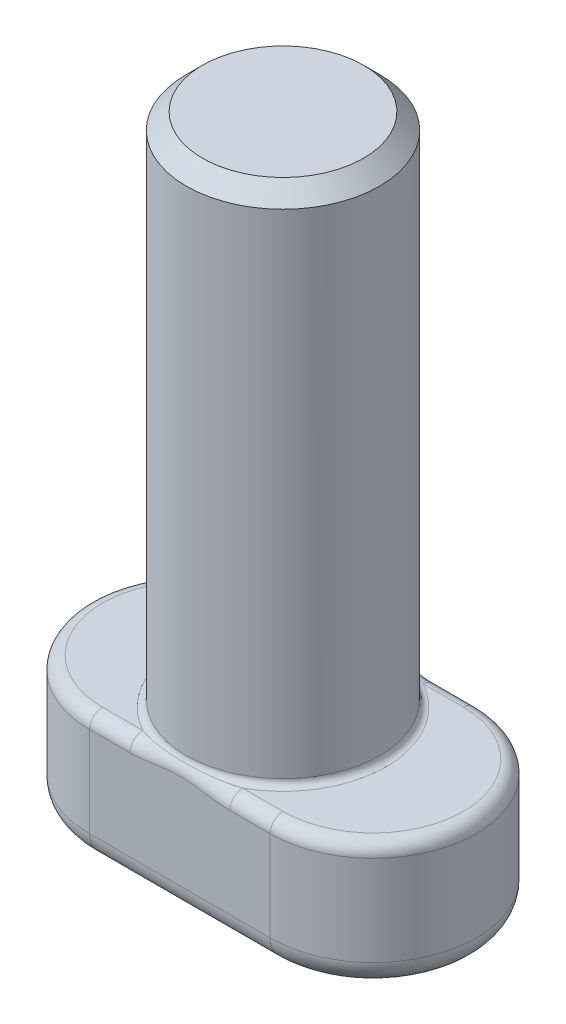
ISO-10303-21;
HEADER;
FILE_DESCRIPTION(('STEP AP214'),'2;1');
FILE_NAME('part.step','',(''),(''),'','','');
FILE_SCHEMA(('AUTOMOTIVE_DESIGN { 1 0 10303 214 1 1 1 1 }'));
ENDSEC;
DATA;
#1=APPLICATION_CONTEXT('core data for automotive mechanical design processes');
#2=APPLICATION_PROTOCOL_DEFINITION('international standard','automotive_design',2000,#1);
#3=PRODUCT_CONTEXT('',#1,'mechanical');
#4=PRODUCT('Part','Part','',(#3));
#5=PRODUCT_RELATED_PRODUCT_CATEGORY('part','',(#4));
#6=PRODUCT_DEFINITION_FORMATION('','',#4);
#7=PRODUCT_DEFINITION_CONTEXT('part definition',#1,'design');
#8=PRODUCT_DEFINITION('design','',#6,#7);
#9=PRODUCT_DEFINITION_SHAPE('','',#8);
#10=(LENGTH_UNIT() NAMED_UNIT(*) SI_UNIT(.MILLI.,.METRE.));
#11=(NAMED_UNIT(*) PLANE_ANGLE_UNIT() SI_UNIT($,.RADIAN.));
#12=(NAMED_UNIT(*) SI_UNIT($,.STERADIAN.) SOLID_ANGLE_UNIT());
#13=UNCERTAINTY_MEASURE_WITH_UNIT(LENGTH_MEASURE(1.E-05),#10,'distance_accuracy_value','');
#14=(GEOMETRIC_REPRESENTATION_CONTEXT(3) GLOBAL_UNCERTAINTY_ASSIGNED_CONTEXT((#13)) GLOBAL_UNIT_ASSIGNED_CONTEXT((#10,
#11,#12)) REPRESENTATION_CONTEXT('',''));
#15=CARTESIAN_POINT('',(0.,0.,0.));
#16=DIRECTION('',(0.,0.,1.));
#17=DIRECTION('',(1.,0.,0.));
#18=AXIS2_PLACEMENT_3D('',#15,#16,#17);
#19=CARTESIAN_POINT('',(1.4,0.,-1.6));
#20=DIRECTION('',(0.,0.,-1.));
#21=DIRECTION('',(-1.,0.,0.));
#22=AXIS2_PLACEMENT_3D('',#19,#20,#21);
#23=PLANE('',#22);
#24=DIRECTION('',(-1.,0.,0.));
#25=VECTOR('',#24,1.);
#26=CARTESIAN_POINT('',(1.4,1.8,-1.6));
#27=LINE('',#26,#25);
#28=CARTESIAN_POINT('',(0.774596669241484,1.8,-1.6));
#29=VERTEX_POINT('',#28);
#30=CARTESIAN_POINT('',(1.4,1.8,-1.6));
#31=VERTEX_POINT('',#30);
#32=EDGE_CURVE('E369',#29,#31,#27,.F.);
#33=ORIENTED_EDGE('',*,*,#32,.T.);
#34=DIRECTION('',(0.,1.,0.));
#35=VECTOR('',#34,1.);
#36=CARTESIAN_POINT('',(1.4,0.,-1.6));
#37=LINE('',#36,#35);
#38=CARTESIAN_POINT('',(1.4,0.4,-1.6));
#39=VERTEX_POINT('',#38);
#40=EDGE_CURVE('E374',#31,#39,#37,.F.);
#41=ORIENTED_EDGE('',*,*,#40,.T.);
#42=DIRECTION('',(-1.,0.,0.));
#43=VECTOR('',#42,1.);
#44=CARTESIAN_POINT('',(0.700000000000001,0.4,-1.6));
#45=LINE('',#44,#43);
#46=CARTESIAN_POINT('',(-1.40000000000001,0.4,-1.6));
#47=VERTEX_POINT('',#46);
#48=EDGE_CURVE('E144',#47,#39,#45,.F.);
#49=ORIENTED_EDGE('',*,*,#48,.F.);
#50=DIRECTION('',(0.,1.,0.));
#51=VECTOR('',#50,1.);
#52=CARTESIAN_POINT('',(-1.40000000000001,0.,-1.6));
#53=LINE('',#52,#51);
#54=CARTESIAN_POINT('',(-1.40000000000001,1.8,-1.6));
#55=VERTEX_POINT('',#54);
#56=EDGE_CURVE('E118',#47,#55,#53,.T.);
#57=ORIENTED_EDGE('',*,*,#56,.T.);
#58=DIRECTION('',(-1.,0.,0.));
#59=VECTOR('',#58,1.);
#60=CARTESIAN_POINT('',(1.4,1.8,-1.6));
#61=LINE('',#60,#59);
#62=CARTESIAN_POINT('',(-0.774596669241484,1.8,-1.6));
#63=VERTEX_POINT('',#62);
#64=EDGE_CURVE('E106',#55,#63,#61,.F.);
#65=ORIENTED_EDGE('',*,*,#64,.T.);
#66=CARTESIAN_POINT('',(0.774596669241484,1.8,-1.6));
#67=CARTESIAN_POINT('',(0.700387533813011,1.8,-1.6));
#68=CARTESIAN_POINT('',(0.552177147236711,1.81281167700233,-1.6));
#69=CARTESIAN_POINT('',(0.33258746979351,1.84782575622095,-1.6));
#70=CARTESIAN_POINT('',(0.111669796749093,1.87763804248562,-1.6));
#71=CARTESIAN_POINT('',(-0.11161902303895,1.87737160627196,-1.6));
#72=CARTESIAN_POINT('',(-0.332467757344064,1.84774445479143,-1.6));
#73=CARTESIAN_POINT('',(-0.552223442037981,1.81266375856778,-1.6));
#74=CARTESIAN_POINT('',(-0.700387533813012,1.8,-1.6));
#75=CARTESIAN_POINT('',(-0.774596669241484,1.8,-1.6));
#76=B_SPLINE_CURVE_WITH_KNOTS('',3,(#66,#67,#68,#69,#70,#71,#72,#73,#74,#75),.UNSPECIFIED.,.F.,
.F.,(4,1,1,1,1,1,1,4),(0.,0.0222627406285417,0.0445254812570834,0.0667882218856252,
0.0890509625141669,0.111313703142709,0.13357644377125,0.155839184399792),.UNSPECIFIED.);
#77=EDGE_CURVE('E117',#63,#29,#76,.F.);
#78=ORIENTED_EDGE('',*,*,#77,.T.);
#79=EDGE_LOOP('',(#33,#41,#49,#57,#65,#78));
#80=FACE_BOUND('',#79,.T.);
#81=ADVANCED_FACE('F16',(#80),#23,.T.);
#82=CARTESIAN_POINT('',(-1.4,0.,1.6));
#83=DIRECTION('',(0.,0.,1.));
#84=DIRECTION('',(1.,0.,0.));
#85=AXIS2_PLACEMENT_3D('',#82,#83,#84);
#86=PLANE('',#85);
#87=DIRECTION('',(1.,0.,0.));
#88=VECTOR('',#87,1.);
#89=CARTESIAN_POINT('',(-1.4,1.8,1.6));
#90=LINE('',#89,#88);
#91=CARTESIAN_POINT('',(-0.774596669241484,1.8,1.6));
#92=VERTEX_POINT('',#91);
#93=CARTESIAN_POINT('',(-1.4,1.8,1.6));
#94=VERTEX_POINT('',#93);
#95=EDGE_CURVE('E409',#92,#94,#90,.F.);
#96=ORIENTED_EDGE('',*,*,#95,.T.);
#97=DIRECTION('',(0.,1.,0.));
#98=VECTOR('',#97,1.);
#99=CARTESIAN_POINT('',(-1.4,0.,1.6));
#100=LINE('',#99,#98);
#101=CARTESIAN_POINT('',(-1.4,0.4,1.6));
#102=VERTEX_POINT('',#101);
#103=EDGE_CURVE('E137',#94,#102,#100,.F.);
#104=ORIENTED_EDGE('',*,*,#103,.T.);
#105=DIRECTION('',(1.,0.,0.));
#106=VECTOR('',#105,1.);
#107=CARTESIAN_POINT('',(-0.699999999999999,0.4,1.6));
#108=LINE('',#107,#106);
#109=CARTESIAN_POINT('',(1.4,0.4,1.6));
#110=VERTEX_POINT('',#109);
#111=EDGE_CURVE('E668',#110,#102,#108,.F.);
#112=ORIENTED_EDGE('',*,*,#111,.F.);
#113=DIRECTION('',(0.,1.,0.));
#114=VECTOR('',#113,1.);
#115=CARTESIAN_POINT('',(1.4,0.,1.6));
#116=LINE('',#115,#114);
#117=CARTESIAN_POINT('',(1.4,1.8,1.6));
#118=VERTEX_POINT('',#117);
#119=EDGE_CURVE('E378',#110,#118,#116,.T.);
#120=ORIENTED_EDGE('',*,*,#119,.T.);
#121=DIRECTION('',(1.,0.,0.));
#122=VECTOR('',#121,1.);
#123=CARTESIAN_POINT('',(-1.4,1.8,1.6));
#124=LINE('',#123,#122);
#125=CARTESIAN_POINT('',(0.774596669241484,1.8,1.6));
#126=VERTEX_POINT('',#125);
#127=EDGE_CURVE('E405',#118,#126,#124,.F.);
#128=ORIENTED_EDGE('',*,*,#127,.T.);
#129=CARTESIAN_POINT('',(-0.774596669241484,1.8,1.6));
#130=CARTESIAN_POINT('',(-0.700387533813012,1.8,1.6));
#131=CARTESIAN_POINT('',(-0.552177147236712,1.81281167700233,1.6));
#132=CARTESIAN_POINT('',(-0.332587469793511,1.84782575622095,1.6));
#133=CARTESIAN_POINT('',(-0.111669796749093,1.87763804248562,1.6));
#134=CARTESIAN_POINT('',(0.111619023038949,1.87737160627196,1.6));
#135=CARTESIAN_POINT('',(0.332467757344063,1.84774445479143,1.6));
#136=CARTESIAN_POINT('',(0.55222344203798,1.81266375856778,1.6));
#137=CARTESIAN_POINT('',(0.700387533813011,1.8,1.6));
#138=CARTESIAN_POINT('',(0.774596669241484,1.8,1.6));
#139=B_SPLINE_CURVE_WITH_KNOTS('',3,(#129,#130,#131,#132,#133,#134,#135,#136,#137,#138),
.UNSPECIFIED.,.F.,.F.,(4,1,1,1,1,1,1,4),(0.,0.0222627406285417,0.0445254812570835,
0.0667882218856252,0.0890509625141669,0.111313703142709,0.13357644377125,0.155839184399792),.UNSPECIFIED.);
#140=EDGE_CURVE('E158',#126,#92,#139,.F.);
#141=ORIENTED_EDGE('',*,*,#140,.T.);
#142=EDGE_LOOP('',(#96,#104,#112,#120,#128,#141));
#143=FACE_BOUND('',#142,.T.);
#144=ADVANCED_FACE('F421',(#143),#86,.T.);
#145=CARTESIAN_POINT('',(0.700000000000001,0.4,-1.2));
#146=DIRECTION('',(-1.,0.,0.));
#147=DIRECTION('',(0.,0.,1.));
#148=AXIS2_PLACEMENT_3D('',#145,#146,#147);
#149=CYLINDRICAL_SURFACE('',#148,0.4);
#150=CARTESIAN_POINT('',(1.4,0.4,-1.2));
#151=DIRECTION('',(-1.,0.,0.));
#152=DIRECTION('',(0.,0.,1.));
#153=AXIS2_PLACEMENT_3D('',#150,#151,#152);
#154=CIRCLE('',#153,0.4);
#155=CARTESIAN_POINT('',(1.4,0.,-1.2));
#156=VERTEX_POINT('',#155);
#157=EDGE_CURVE('E395',#39,#156,#154,.T.);
#158=ORIENTED_EDGE('',*,*,#157,.T.);
#159=DIRECTION('',(1.,0.,0.));
#160=VECTOR('',#159,1.);
#161=CARTESIAN_POINT('',(0.,0.,-1.2));
#162=LINE('',#161,#160);
#163=CARTESIAN_POINT('',(-1.40000000000001,0.,-1.2));
#164=VERTEX_POINT('',#163);
#165=EDGE_CURVE('E473',#156,#164,#162,.F.);
#166=ORIENTED_EDGE('',*,*,#165,.T.);
#167=CARTESIAN_POINT('',(-1.40000000000001,0.4,-1.2));
#168=DIRECTION('',(-1.,0.,0.));
#169=DIRECTION('',(0.,0.,1.));
#170=AXIS2_PLACEMENT_3D('',#167,#168,#169);
#171=CIRCLE('',#170,0.4);
#172=EDGE_CURVE('E396',#164,#47,#171,.F.);
#173=ORIENTED_EDGE('',*,*,#172,.T.);
#174=ORIENTED_EDGE('',*,*,#48,.T.);
#175=EDGE_LOOP('',(#158,#166,#173,#174));
#176=FACE_BOUND('',#175,.T.);
#177=ADVANCED_FACE('F430',(#176),#149,.T.);
#178=CARTESIAN_POINT('',(-0.699999999999999,0.4,1.2));
#179=DIRECTION('',(1.,0.,0.));
#180=DIRECTION('',(0.,0.,-1.));
#181=AXIS2_PLACEMENT_3D('',#178,#179,#180);
#182=CYLINDRICAL_SURFACE('',#181,0.4);
#183=CARTESIAN_POINT('',(-1.4,0.4,1.2));
#184=DIRECTION('',(1.,0.,0.));
#185=DIRECTION('',(0.,0.,-1.));
#186=AXIS2_PLACEMENT_3D('',#183,#184,#185);
#187=CIRCLE('',#186,0.4);
#188=CARTESIAN_POINT('',(-1.4,0.,1.2));
#189=VERTEX_POINT('',#188);
#190=EDGE_CURVE('E482',#102,#189,#187,.T.);
#191=ORIENTED_EDGE('',*,*,#190,.T.);
#192=DIRECTION('',(1.,0.,0.));
#193=VECTOR('',#192,1.);
#194=CARTESIAN_POINT('',(0.,0.,1.2));
#195=LINE('',#194,#193);
#196=CARTESIAN_POINT('',(1.4,0.,1.2));
#197=VERTEX_POINT('',#196);
#198=EDGE_CURVE('E470',#189,#197,#195,.T.);
#199=ORIENTED_EDGE('',*,*,#198,.T.);
#200=CARTESIAN_POINT('',(1.4,0.4,1.2));
#201=DIRECTION('',(1.,0.,0.));
#202=DIRECTION('',(0.,0.,-1.));
#203=AXIS2_PLACEMENT_3D('',#200,#201,#202);
#204=CIRCLE('',#203,0.4);
#205=EDGE_CURVE('E666',#197,#110,#204,.F.);
#206=ORIENTED_EDGE('',*,*,#205,.T.);
#207=ORIENTED_EDGE('',*,*,#111,.T.);
#208=EDGE_LOOP('',(#191,#199,#206,#207));
#209=FACE_BOUND('',#208,.T.);
#210=ADVANCED_FACE('F434',(#209),#182,.T.);
#211=CARTESIAN_POINT('',(0.,0.,0.));
#212=DIRECTION('',(0.,1.,0.));
#213=DIRECTION('',(0.,0.,1.));
#214=AXIS2_PLACEMENT_3D('',#211,#212,#213);
#215=PLANE('',#214);
#216=ORIENTED_EDGE('',*,*,#198,.F.);
#217=CARTESIAN_POINT('',(-1.4,0.,0.));
#218=DIRECTION('',(0.,1.,0.));
#219=DIRECTION('',(0.,0.,-1.));
#220=AXIS2_PLACEMENT_3D('',#217,#218,#219);
#221=CIRCLE('',#220,1.2);
#222=EDGE_CURVE('E476',#164,#189,#221,.T.);
#223=ORIENTED_EDGE('',*,*,#222,.F.);
#224=ORIENTED_EDGE('',*,*,#165,.F.);
#225=CARTESIAN_POINT('',(1.4,0.,0.));
#226=DIRECTION('',(0.,1.,0.));
#227=DIRECTION('',(0.,0.,1.));
#228=AXIS2_PLACEMENT_3D('',#225,#226,#227);
#229=CIRCLE('',#228,1.2);
#230=EDGE_CURVE('E468',#197,#156,#229,.T.);
#231=ORIENTED_EDGE('',*,*,#230,.F.);
#232=EDGE_LOOP('',(#216,#223,#224,#231));
#233=FACE_BOUND('',#232,.T.);
#234=ADVANCED_FACE('F438',(#233),#215,.F.);
#235=CARTESIAN_POINT('',(-1.4,0.4,0.));
#236=DIRECTION('',(0.,1.,0.));
#237=DIRECTION('',(0.,0.,1.));
#238=AXIS2_PLACEMENT_3D('',#235,#236,#237);
#239=TOROIDAL_SURFACE('',#238,1.2,0.4);
#240=ORIENTED_EDGE('',*,*,#172,.F.);
#241=ORIENTED_EDGE('',*,*,#222,.T.);
#242=ORIENTED_EDGE('',*,*,#190,.F.);
#243=CARTESIAN_POINT('',(-1.4,0.4,0.));
#244=DIRECTION('',(0.,1.,0.));
#245=DIRECTION('',(0.,0.,1.));
#246=AXIS2_PLACEMENT_3D('',#243,#244,#245);
#247=CIRCLE('',#246,1.6);
#248=EDGE_CURVE('E401',#47,#102,#247,.T.);
#249=ORIENTED_EDGE('',*,*,#248,.F.);
#250=EDGE_LOOP('',(#240,#241,#242,#249));
#251=FACE_BOUND('',#250,.T.);
#252=ADVANCED_FACE('F443',(#251),#239,.T.);
#253=CARTESIAN_POINT('',(1.4,0.4,0.));
#254=DIRECTION('',(0.,1.,0.));
#255=DIRECTION('',(0.,0.,1.));
#256=AXIS2_PLACEMENT_3D('',#253,#254,#255);
#257=TOROIDAL_SURFACE('',#256,1.2,0.4);
#258=ORIENTED_EDGE('',*,*,#157,.F.);
#259=CARTESIAN_POINT('',(1.4,0.4,0.));
#260=DIRECTION('',(0.,1.,0.));
#261=DIRECTION('',(0.,0.,1.));
#262=AXIS2_PLACEMENT_3D('',#259,#260,#261);
#263=CIRCLE('',#262,1.6);
#264=EDGE_CURVE('E139',#110,#39,#263,.T.);
#265=ORIENTED_EDGE('',*,*,#264,.F.);
#266=ORIENTED_EDGE('',*,*,#205,.F.);
#267=ORIENTED_EDGE('',*,*,#230,.T.);
#268=EDGE_LOOP('',(#258,#265,#266,#267));
#269=FACE_BOUND('',#268,.T.);
#270=ADVANCED_FACE('F492',(#269),#257,.T.);
#271=CARTESIAN_POINT('',(-1.4,0.,0.));
#272=DIRECTION('',(0.,1.,0.));
#273=DIRECTION('',(0.,0.,1.));
#274=AXIS2_PLACEMENT_3D('',#271,#272,#273);
#275=CYLINDRICAL_SURFACE('',#274,1.6);
#276=CARTESIAN_POINT('',(-1.4,1.8,0.));
#277=DIRECTION('',(0.,1.,0.));
#278=DIRECTION('',(0.,0.,1.));
#279=AXIS2_PLACEMENT_3D('',#276,#277,#278);
#280=CIRCLE('',#279,1.6);
#281=EDGE_CURVE('E124',#55,#94,#280,.T.);
#282=ORIENTED_EDGE('',*,*,#281,.F.);
#283=ORIENTED_EDGE('',*,*,#56,.F.);
#284=ORIENTED_EDGE('',*,*,#248,.T.);
#285=ORIENTED_EDGE('',*,*,#103,.F.);
#286=EDGE_LOOP('',(#282,#283,#284,#285));
#287=FACE_BOUND('',#286,.T.);
#288=ADVANCED_FACE('F134',(#287),#275,.T.);
#289=CARTESIAN_POINT('',(1.4,0.,0.));
#290=DIRECTION('',(0.,1.,0.));
#291=DIRECTION('',(0.,0.,1.));
#292=AXIS2_PLACEMENT_3D('',#289,#290,#291);
#293=CYLINDRICAL_SURFACE('',#292,1.6);
#294=CARTESIAN_POINT('',(1.4,1.8,0.));
#295=DIRECTION('',(0.,1.,0.));
#296=DIRECTION('',(0.,0.,1.));
#297=AXIS2_PLACEMENT_3D('',#294,#295,#296);
#298=CIRCLE('',#297,1.6);
#299=EDGE_CURVE('E130',#118,#31,#298,.T.);
#300=ORIENTED_EDGE('',*,*,#299,.F.);
#301=ORIENTED_EDGE('',*,*,#119,.F.);
#302=ORIENTED_EDGE('',*,*,#264,.T.);
#303=ORIENTED_EDGE('',*,*,#40,.F.);
#304=EDGE_LOOP('',(#300,#301,#302,#303));
#305=FACE_BOUND('',#304,.T.);
#306=ADVANCED_FACE('F524',(#305),#293,.T.);
#307=CARTESIAN_POINT('',(-1.4,1.8,0.));
#308=DIRECTION('',(0.,1.,0.));
#309=DIRECTION('',(0.,0.,1.));
#310=AXIS2_PLACEMENT_3D('',#307,#308,#309);
#311=TOROIDAL_SURFACE('',#310,1.4,0.2);
#312=CARTESIAN_POINT('',(-1.40000000000001,1.8,-1.4));
#313=DIRECTION('',(-1.,0.,0.));
#314=DIRECTION('',(0.,0.,1.));
#315=AXIS2_PLACEMENT_3D('',#312,#313,#314);
#316=CIRCLE('',#315,0.2);
#317=CARTESIAN_POINT('',(-1.40000000000001,2.,-1.4));
#318=VERTEX_POINT('',#317);
#319=EDGE_CURVE('E109',#55,#318,#316,.F.);
#320=ORIENTED_EDGE('',*,*,#319,.F.);
#321=ORIENTED_EDGE('',*,*,#281,.T.);
#322=CARTESIAN_POINT('',(-1.4,1.8,1.4));
#323=DIRECTION('',(1.,0.,0.));
#324=DIRECTION('',(0.,0.,-1.));
#325=AXIS2_PLACEMENT_3D('',#322,#323,#324);
#326=CIRCLE('',#325,0.2);
#327=CARTESIAN_POINT('',(-1.4,2.,1.4));
#328=VERTEX_POINT('',#327);
#329=EDGE_CURVE('E266',#328,#94,#326,.T.);
#330=ORIENTED_EDGE('',*,*,#329,.F.);
#331=CARTESIAN_POINT('',(-1.4,2.,0.));
#332=DIRECTION('',(0.,-1.,0.));
#333=DIRECTION('',(0.,0.,1.));
#334=AXIS2_PLACEMENT_3D('',#331,#332,#333);
#335=CIRCLE('',#334,1.4);
#336=EDGE_CURVE('E127',#318,#328,#335,.F.);
#337=ORIENTED_EDGE('',*,*,#336,.F.);
#338=EDGE_LOOP('',(#320,#321,#330,#337));
#339=FACE_BOUND('',#338,.T.);
#340=ADVANCED_FACE('F123',(#339),#311,.T.);
#341=CARTESIAN_POINT('',(0.700000000000001,1.8,-1.4));
#342=DIRECTION('',(-1.,0.,0.));
#343=DIRECTION('',(0.,0.,1.));
#344=AXIS2_PLACEMENT_3D('',#341,#342,#343);
#345=CYLINDRICAL_SURFACE('',#344,0.2);
#346=ORIENTED_EDGE('',*,*,#319,.T.);
#347=DIRECTION('',(1.,0.,0.));
#348=VECTOR('',#347,1.);
#349=CARTESIAN_POINT('',(0.,2.,-1.4));
#350=LINE('',#349,#348);
#351=CARTESIAN_POINT('',(-0.774596669241484,2.,-1.4));
#352=VERTEX_POINT('',#351);
#353=EDGE_CURVE('E695',#352,#318,#350,.F.);
#354=ORIENTED_EDGE('',*,*,#353,.F.);
#355=CARTESIAN_POINT('',(-0.774596669241484,1.8,-1.6));
#356=CARTESIAN_POINT('',(-0.774596669241484,1.85235987755983,-1.6));
#357=CARTESIAN_POINT('',(-0.774596669241484,1.95672309645721,-1.55672309645721));
#358=CARTESIAN_POINT('',(-0.774596669241484,2.,-1.45235987755983));
#359=CARTESIAN_POINT('',(-0.774596669241484,2.,-1.4));
#360=B_SPLINE_CURVE_WITH_KNOTS('',3,(#355,#356,#357,#358,#359),.UNSPECIFIED.,.F.,.F.,(4,1,4),
(0.,0.5,1.),.UNSPECIFIED.);
#361=EDGE_CURVE('E112',#352,#63,#360,.F.);
#362=ORIENTED_EDGE('',*,*,#361,.T.);
#363=ORIENTED_EDGE('',*,*,#64,.F.);
#364=EDGE_LOOP('',(#346,#354,#362,#363));
#365=FACE_BOUND('',#364,.T.);
#366=ADVANCED_FACE('F108',(#365),#345,.T.);
#367=CARTESIAN_POINT('',(1.4,1.8,0.));
#368=DIRECTION('',(0.,1.,0.));
#369=DIRECTION('',(0.,0.,1.));
#370=AXIS2_PLACEMENT_3D('',#367,#368,#369);
#371=TOROIDAL_SURFACE('',#370,1.4,0.2);
#372=CARTESIAN_POINT('',(1.4,1.8,1.4));
#373=DIRECTION('',(1.,0.,0.));
#374=DIRECTION('',(0.,0.,-1.));
#375=AXIS2_PLACEMENT_3D('',#372,#373,#374);
#376=CIRCLE('',#375,0.2);
#377=CARTESIAN_POINT('',(1.4,2.,1.4));
#378=VERTEX_POINT('',#377);
#379=EDGE_CURVE('E258',#118,#378,#376,.F.);
#380=ORIENTED_EDGE('',*,*,#379,.F.);
#381=ORIENTED_EDGE('',*,*,#299,.T.);
#382=CARTESIAN_POINT('',(1.4,1.8,-1.4));
#383=DIRECTION('',(-1.,0.,0.));
#384=DIRECTION('',(0.,0.,1.));
#385=AXIS2_PLACEMENT_3D('',#382,#383,#384);
#386=CIRCLE('',#385,0.2);
#387=CARTESIAN_POINT('',(1.4,2.,-1.4));
#388=VERTEX_POINT('',#387);
#389=EDGE_CURVE('E367',#388,#31,#386,.T.);
#390=ORIENTED_EDGE('',*,*,#389,.F.);
#391=CARTESIAN_POINT('',(1.4,2.,0.));
#392=DIRECTION('',(0.,-1.,0.));
#393=DIRECTION('',(0.,0.,-1.));
#394=AXIS2_PLACEMENT_3D('',#391,#392,#393);
#395=CIRCLE('',#394,1.4);
#396=EDGE_CURVE('E254',#378,#388,#395,.F.);
#397=ORIENTED_EDGE('',*,*,#396,.F.);
#398=EDGE_LOOP('',(#380,#381,#390,#397));
#399=FACE_BOUND('',#398,.T.);
#400=ADVANCED_FACE('F235',(#399),#371,.T.);
#401=CARTESIAN_POINT('',(0.700000000000001,1.8,-1.4));
#402=DIRECTION('',(-1.,0.,0.));
#403=DIRECTION('',(0.,0.,1.));
#404=AXIS2_PLACEMENT_3D('',#401,#402,#403);
#405=CYLINDRICAL_SURFACE('',#404,0.2);
#406=ORIENTED_EDGE('',*,*,#389,.T.);
#407=ORIENTED_EDGE('',*,*,#32,.F.);
#408=CARTESIAN_POINT('',(0.774596669241484,2.,-1.4));
#409=CARTESIAN_POINT('',(0.774596669241484,2.,-1.45235987755983));
#410=CARTESIAN_POINT('',(0.774596669241484,1.95672309645721,-1.55672309645721));
#411=CARTESIAN_POINT('',(0.774596669241484,1.85235987755983,-1.6));
#412=CARTESIAN_POINT('',(0.774596669241484,1.8,-1.6));
#413=B_SPLINE_CURVE_WITH_KNOTS('',3,(#408,#409,#410,#411,#412),.UNSPECIFIED.,.F.,.F.,(4,1,4),
(0.,0.5,1.),.UNSPECIFIED.);
#414=CARTESIAN_POINT('',(0.774596669241484,2.,-1.4));
#415=VERTEX_POINT('',#414);
#416=EDGE_CURVE('E217',#29,#415,#413,.F.);
#417=ORIENTED_EDGE('',*,*,#416,.T.);
#418=DIRECTION('',(1.,0.,0.));
#419=VECTOR('',#418,1.);
#420=CARTESIAN_POINT('',(0.,2.,-1.4));
#421=LINE('',#420,#419);
#422=EDGE_CURVE('E326',#388,#415,#421,.F.);
#423=ORIENTED_EDGE('',*,*,#422,.F.);
#424=EDGE_LOOP('',(#406,#407,#417,#423));
#425=FACE_BOUND('',#424,.T.);
#426=ADVANCED_FACE('F224',(#425),#405,.T.);
#427=CARTESIAN_POINT('',(-0.699999999999999,1.8,1.4));
#428=DIRECTION('',(1.,0.,0.));
#429=DIRECTION('',(0.,0.,-1.));
#430=AXIS2_PLACEMENT_3D('',#427,#428,#429);
#431=CYLINDRICAL_SURFACE('',#430,0.2);
#432=ORIENTED_EDGE('',*,*,#329,.T.);
#433=ORIENTED_EDGE('',*,*,#95,.F.);
#434=CARTESIAN_POINT('',(-0.774596669241484,2.,1.4));
#435=CARTESIAN_POINT('',(-0.774596669241484,2.,1.45235987755983));
#436=CARTESIAN_POINT('',(-0.774596669241484,1.95672309645721,1.55672309645721));
#437=CARTESIAN_POINT('',(-0.774596669241484,1.85235987755983,1.6));
#438=CARTESIAN_POINT('',(-0.774596669241484,1.8,1.6));
#439=B_SPLINE_CURVE_WITH_KNOTS('',3,(#434,#435,#436,#437,#438),.UNSPECIFIED.,.F.,.F.,(4,1,4),
(0.,0.5,1.),.UNSPECIFIED.);
#440=CARTESIAN_POINT('',(-0.774596669241484,2.,1.4));
#441=VERTEX_POINT('',#440);
#442=EDGE_CURVE('E328',#92,#441,#439,.F.);
#443=ORIENTED_EDGE('',*,*,#442,.T.);
#444=DIRECTION('',(1.,0.,0.));
#445=VECTOR('',#444,1.);
#446=CARTESIAN_POINT('',(0.,2.,1.4));
#447=LINE('',#446,#445);
#448=EDGE_CURVE('E265',#328,#441,#447,.T.);
#449=ORIENTED_EDGE('',*,*,#448,.F.);
#450=EDGE_LOOP('',(#432,#433,#443,#449));
#451=FACE_BOUND('',#450,.T.);
#452=ADVANCED_FACE('F234',(#451),#431,.T.);
#453=CARTESIAN_POINT('',(-0.699999999999999,1.8,1.4));
#454=DIRECTION('',(1.,0.,0.));
#455=DIRECTION('',(0.,0.,-1.));
#456=AXIS2_PLACEMENT_3D('',#453,#454,#455);
#457=CYLINDRICAL_SURFACE('',#456,0.2);
#458=ORIENTED_EDGE('',*,*,#379,.T.);
#459=DIRECTION('',(1.,0.,0.));
#460=VECTOR('',#459,1.);
#461=CARTESIAN_POINT('',(0.,2.,1.4));
#462=LINE('',#461,#460);
#463=CARTESIAN_POINT('',(0.774596669241484,2.,1.4));
#464=VERTEX_POINT('',#463);
#465=EDGE_CURVE('E38',#464,#378,#462,.T.);
#466=ORIENTED_EDGE('',*,*,#465,.F.);
#467=CARTESIAN_POINT('',(0.774596669241484,1.8,1.6));
#468=CARTESIAN_POINT('',(0.774596669241484,1.85235987755983,1.6));
#469=CARTESIAN_POINT('',(0.774596669241484,1.95672309645721,1.55672309645721));
#470=CARTESIAN_POINT('',(0.774596669241484,2.,1.45235987755983));
#471=CARTESIAN_POINT('',(0.774596669241484,2.,1.4));
#472=B_SPLINE_CURVE_WITH_KNOTS('',3,(#467,#468,#469,#470,#471),.UNSPECIFIED.,.F.,.F.,(4,1,4),
(0.,0.5,1.),.UNSPECIFIED.);
#473=EDGE_CURVE('E363',#464,#126,#472,.F.);
#474=ORIENTED_EDGE('',*,*,#473,.T.);
#475=ORIENTED_EDGE('',*,*,#127,.F.);
#476=EDGE_LOOP('',(#458,#466,#474,#475));
#477=FACE_BOUND('',#476,.T.);
#478=ADVANCED_FACE('F572',(#477),#457,.T.);
#479=CARTESIAN_POINT('',(0.,2.,0.));
#480=DIRECTION('',(0.,1.,0.));
#481=DIRECTION('',(0.,0.,1.));
#482=AXIS2_PLACEMENT_3D('',#479,#480,#481);
#483=PLANE('',#482);
#484=ORIENTED_EDGE('',*,*,#353,.T.);
#485=ORIENTED_EDGE('',*,*,#336,.T.);
#486=ORIENTED_EDGE('',*,*,#448,.T.);
#487=CARTESIAN_POINT('',(0.,2.,0.));
#488=DIRECTION('',(0.,1.,0.));
#489=DIRECTION('',(-0.484122918275928,0.,-0.875));
#490=AXIS2_PLACEMENT_3D('',#487,#488,#489);
#491=CIRCLE('',#490,1.6);
#492=EDGE_CURVE('E278',#441,#352,#491,.F.);
#493=ORIENTED_EDGE('',*,*,#492,.T.);
#494=EDGE_LOOP('',(#484,#485,#486,#493));
#495=FACE_BOUND('',#494,.T.);
#496=ADVANCED_FACE('F183',(#495),#483,.T.);
#497=CARTESIAN_POINT('',(0.774596669241484,1.8,-1.6));
#498=CARTESIAN_POINT('',(0.700387533813011,1.8,-1.6));
#499=CARTESIAN_POINT('',(0.552177147236711,1.81281167700233,-1.6));
#500=CARTESIAN_POINT('',(0.33258746979351,1.84782575622095,-1.6));
#501=CARTESIAN_POINT('',(0.111669796749093,1.87763804248562,-1.6));
#502=CARTESIAN_POINT('',(-0.11161902303895,1.87737160627196,-1.6));
#503=CARTESIAN_POINT('',(-0.332467757344064,1.84774445479143,-1.6));
#504=CARTESIAN_POINT('',(-0.552223442037981,1.81266375856778,-1.6));
#505=CARTESIAN_POINT('',(-0.700387533813012,1.8,-1.6));
#506=CARTESIAN_POINT('',(-0.774596669241484,1.8,-1.6));
#507=CARTESIAN_POINT('',(0.774596669241484,1.85235987755983,-1.6));
#508=CARTESIAN_POINT('',(0.703428100857881,1.8488359908818,-1.59988595040864));
#509=CARTESIAN_POINT('',(0.558168074914489,1.85451541078744,-1.59979902295523));
#510=CARTESIAN_POINT('',(0.337989942871566,1.8808831729616,-1.59971350327062));
#511=CARTESIAN_POINT('',(0.113781174115758,1.90539301559849,-1.59969449828969));
#512=CARTESIAN_POINT('',(-0.113730022935181,1.90515229930441,-1.59970133440548));
#513=CARTESIAN_POINT('',(-0.337870195056682,1.88080626148408,-1.59971122630322));
#514=CARTESIAN_POINT('',(-0.558215011005705,1.8543827100453,-1.59979881262343));
#515=CARTESIAN_POINT('',(-0.703428100857879,1.8488359908818,-1.59988595040864));
#516=CARTESIAN_POINT('',(-0.774596669241484,1.85235987755983,-1.6));
#517=CARTESIAN_POINT('',(0.774596669241484,1.95672309645721,-1.55672309645721));
#518=CARTESIAN_POINT('',(0.709458276680838,1.94645661466236,-1.56285100482593));
#519=CARTESIAN_POINT('',(0.570113761156739,1.93812687399193,-1.57308239618957));
#520=CARTESIAN_POINT('',(0.348783769278581,1.94735266095545,-1.58323689953137));
#521=CARTESIAN_POINT('',(0.118002503121437,1.96128412202342,-1.58844423997559));
#522=CARTESIAN_POINT('',(-0.117950546707858,1.9610861278276,-1.58843371743589));
#523=CARTESIAN_POINT('',(-0.348663800922481,1.94728759616185,-1.58324133056248));
#524=CARTESIAN_POINT('',(-0.570161930342631,1.93802491891547,-1.57307683311644));
#525=CARTESIAN_POINT('',(-0.709458276680831,1.94645661466236,-1.56285100482593));
#526=CARTESIAN_POINT('',(-0.774596669241484,1.95672309645721,-1.55672309645721));
#527=CARTESIAN_POINT('',(0.774596669241484,2.,-1.45235987755983));
#528=CARTESIAN_POINT('',(0.71200693089924,1.99439045316234,-1.46983679887216));
#529=CARTESIAN_POINT('',(0.577423251579639,1.99042372267585,-1.50152403852196));
#530=CARTESIAN_POINT('',(0.357128863946784,1.9973567133064,-1.53610004305196));
#531=CARTESIAN_POINT('',(0.121617702385998,2.00686770843667,-1.55496536904477));
#532=CARTESIAN_POINT('',(-0.121561728657003,2.00674786991036,-1.55492947834284));
#533=CARTESIAN_POINT('',(-0.357008891008973,1.99731082324637,-1.53610631585212));
#534=CARTESIAN_POINT('',(-0.57747332741644,1.99035572797392,-1.50149907681011));
#535=CARTESIAN_POINT('',(-0.712006930899231,1.99439045316234,-1.46983679887216));
#536=CARTESIAN_POINT('',(-0.774596669241484,2.,-1.45235987755983));
#537=CARTESIAN_POINT('',(0.774596669241484,2.,-1.4));
#538=CARTESIAN_POINT('',(0.71198271122372,2.,-1.42095703353705));
#539=CARTESIAN_POINT('',(0.579122806456343,2.00427055900078,-1.46106872397485));
#540=CARTESIAN_POINT('',(0.3601957038681,2.01594191874032,-1.50786989355545));
#541=CARTESIAN_POINT('',(0.123142575837898,2.02587934749521,-1.53444591069328));
#542=CARTESIAN_POINT('',(-0.1230829956571,2.02579053542399,-1.53438026430683));
#543=CARTESIAN_POINT('',(-0.360075091605916,2.01591481826381,-1.50787456417969));
#544=CARTESIAN_POINT('',(-0.579174578905693,2.00422125285593,-1.46102904808302));
#545=CARTESIAN_POINT('',(-0.71198271122371,2.,-1.42095703353705));
#546=CARTESIAN_POINT('',(-0.774596669241484,2.,-1.4));
#547=B_SPLINE_SURFACE_WITH_KNOTS('',3,3,((#497,#498,#499,#500,#501,#502,#503,#504,#505,#506),
(#507,#508,#509,#510,#511,#512,#513,#514,#515,#516),(#517,#518,#519,#520,#521,#522,#523,#524,
#525,#526),(#527,#528,#529,#530,#531,#532,#533,#534,#535,#536),(#537,#538,#539,#540,#541,#542,
#543,#544,#545,#546)),.UNSPECIFIED.,.F.,.F.,.F.,(4,1,4),(4,1,1,1,1,1,1,4),(0.,0.5,1.),(0.,
0.0222627406285417,0.0445254812570834,0.0667882218856252,0.0890509625141669,0.111313703142709,
0.13357644377125,0.155839184399792),.UNSPECIFIED.);
#548=CARTESIAN_POINT('',(-0.774596669241484,2.,-1.4));
#549=CARTESIAN_POINT('',(-0.71198271122371,2.,-1.42095703353705));
#550=CARTESIAN_POINT('',(-0.579174578905693,2.00422125285593,-1.46102904808302));
#551=CARTESIAN_POINT('',(-0.360075091605916,2.01591481826381,-1.50787456417969));
#552=CARTESIAN_POINT('',(-0.1230829956571,2.02579053542399,-1.53438026430683));
#553=CARTESIAN_POINT('',(0.123142575837898,2.02587934749521,-1.53444591069328));
#554=CARTESIAN_POINT('',(0.3601957038681,2.01594191874032,-1.50786989355545));
#555=CARTESIAN_POINT('',(0.579122806456343,2.00427055900078,-1.46106872397485));
#556=CARTESIAN_POINT('',(0.71198271122372,2.,-1.42095703353705));
#557=CARTESIAN_POINT('',(0.774596669241484,2.,-1.4));
#558=B_SPLINE_CURVE_WITH_KNOTS('',3,(#548,#549,#550,#551,#552,#553,#554,#555,#556,#557),
.UNSPECIFIED.,.F.,.F.,(4,1,1,1,1,1,1,4),(0.,0.022262740628542,0.044525481257083,
0.0667882218856251,0.0890509625141668,0.111313703142709,0.13357644377125,0.155839184399792),.UNSPECIFIED.);
#559=EDGE_CURVE('E269',#352,#415,#558,.T.);
#560=ORIENTED_EDGE('',*,*,#559,.T.);
#561=ORIENTED_EDGE('',*,*,#416,.F.);
#562=ORIENTED_EDGE('',*,*,#77,.F.);
#563=ORIENTED_EDGE('',*,*,#361,.F.);
#564=EDGE_LOOP('',(#560,#561,#562,#563));
#565=FACE_BOUND('',#564,.T.);
#566=ADVANCED_FACE('F171',(#565),#547,.F.);
#567=CARTESIAN_POINT('',(0.,2.,0.));
#568=DIRECTION('',(0.,1.,0.));
#569=DIRECTION('',(0.,0.,1.));
#570=AXIS2_PLACEMENT_3D('',#567,#568,#569);
#571=PLANE('',#570);
#572=ORIENTED_EDGE('',*,*,#422,.T.);
#573=CARTESIAN_POINT('',(0.,2.,0.));
#574=DIRECTION('',(0.,1.,0.));
#575=DIRECTION('',(0.484122918275928,0.,0.875));
#576=AXIS2_PLACEMENT_3D('',#573,#574,#575);
#577=CIRCLE('',#576,1.6);
#578=EDGE_CURVE('E280',#415,#464,#577,.F.);
#579=ORIENTED_EDGE('',*,*,#578,.T.);
#580=ORIENTED_EDGE('',*,*,#465,.T.);
#581=ORIENTED_EDGE('',*,*,#396,.T.);
#582=EDGE_LOOP('',(#572,#579,#580,#581));
#583=FACE_BOUND('',#582,.T.);
#584=ADVANCED_FACE('F182',(#583),#571,.T.);
#585=CARTESIAN_POINT('',(-0.774596669241484,1.8,1.6));
#586=CARTESIAN_POINT('',(-0.700387533813012,1.8,1.6));
#587=CARTESIAN_POINT('',(-0.552177147236712,1.81281167700233,1.6));
#588=CARTESIAN_POINT('',(-0.332587469793511,1.84782575622095,1.6));
#589=CARTESIAN_POINT('',(-0.111669796749093,1.87763804248562,1.6));
#590=CARTESIAN_POINT('',(0.111619023038949,1.87737160627196,1.6));
#591=CARTESIAN_POINT('',(0.332467757344063,1.84774445479143,1.6));
#592=CARTESIAN_POINT('',(0.55222344203798,1.81266375856778,1.6));
#593=CARTESIAN_POINT('',(0.700387533813011,1.8,1.6));
#594=CARTESIAN_POINT('',(0.774596669241484,1.8,1.6));
#595=CARTESIAN_POINT('',(-0.774596669241484,1.85235987755983,1.6));
#596=CARTESIAN_POINT('',(-0.703428100857876,1.8488359908818,1.59988595040864));
#597=CARTESIAN_POINT('',(-0.558168074914488,1.85451541078744,1.59979902295523));
#598=CARTESIAN_POINT('',(-0.337989942871565,1.8808831729616,1.59971350327062));
#599=CARTESIAN_POINT('',(-0.113781174115758,1.90539301559848,1.59969449828968));
#600=CARTESIAN_POINT('',(0.113730022935181,1.90515229930441,1.59970133440548));
#601=CARTESIAN_POINT('',(0.337870195056682,1.88080626148408,1.59971122630322));
#602=CARTESIAN_POINT('',(0.558215011005705,1.8543827100453,1.59979881262343));
#603=CARTESIAN_POINT('',(0.703428100857878,1.8488359908818,1.59988595040864));
#604=CARTESIAN_POINT('',(0.774596669241484,1.85235987755983,1.6));
#605=CARTESIAN_POINT('',(-0.774596669241484,1.95672309645721,1.55672309645721));
#606=CARTESIAN_POINT('',(-0.709458276680824,1.94645661466236,1.56285100482593));
#607=CARTESIAN_POINT('',(-0.570113761156737,1.93812687399193,1.57308239618957));
#608=CARTESIAN_POINT('',(-0.348783769278577,1.94735266095545,1.58323689953137));
#609=CARTESIAN_POINT('',(-0.118002503121435,1.96128412202342,1.58844423997559));
#610=CARTESIAN_POINT('',(0.117950546707861,1.9610861278276,1.58843371743589));
#611=CARTESIAN_POINT('',(0.34866380092248,1.94728759616185,1.58324133056248));
#612=CARTESIAN_POINT('',(0.570161930342632,1.93802491891547,1.57307683311644));
#613=CARTESIAN_POINT('',(0.709458276680831,1.94645661466236,1.56285100482593));
#614=CARTESIAN_POINT('',(0.774596669241484,1.95672309645721,1.55672309645721));
#615=CARTESIAN_POINT('',(-0.774596669241484,2.,1.45235987755983));
#616=CARTESIAN_POINT('',(-0.712006930899222,1.99439045316234,1.46983679887216));
#617=CARTESIAN_POINT('',(-0.577423251579636,1.99042372267585,1.50152403852196));
#618=CARTESIAN_POINT('',(-0.357128863946778,1.9973567133064,1.53610004305197));
#619=CARTESIAN_POINT('',(-0.121617702385996,2.00686770843667,1.55496536904477));
#620=CARTESIAN_POINT('',(0.121561728657006,2.00674786991035,1.55492947834283));
#621=CARTESIAN_POINT('',(0.357008891008974,1.99731082324637,1.53610631585212));
#622=CARTESIAN_POINT('',(0.57747332741644,1.99035572797392,1.50149907681011));
#623=CARTESIAN_POINT('',(0.712006930899231,1.99439045316234,1.46983679887216));
#624=CARTESIAN_POINT('',(0.774596669241484,2.,1.45235987755983));
#625=CARTESIAN_POINT('',(-0.774596669241484,2.,1.4));
#626=CARTESIAN_POINT('',(-0.711982711223701,2.,1.42095703353705));
#627=CARTESIAN_POINT('',(-0.57912280645634,2.00427055900078,1.46106872397485));
#628=CARTESIAN_POINT('',(-0.360195703868095,2.01594191874032,1.50786989355545));
#629=CARTESIAN_POINT('',(-0.123142575837896,2.02587934749521,1.53444591069328));
#630=CARTESIAN_POINT('',(0.123082995657104,2.02579053542399,1.53438026430683));
#631=CARTESIAN_POINT('',(0.360075091605916,2.01591481826381,1.50787456417969));
#632=CARTESIAN_POINT('',(0.579174578905693,2.00422125285593,1.46102904808302));
#633=CARTESIAN_POINT('',(0.71198271122371,2.,1.42095703353705));
#634=CARTESIAN_POINT('',(0.774596669241484,2.,1.4));
#635=B_SPLINE_SURFACE_WITH_KNOTS('',3,3,((#585,#586,#587,#588,#589,#590,#591,#592,#593,#594),
(#595,#596,#597,#598,#599,#600,#601,#602,#603,#604),(#605,#606,#607,#608,#609,#610,#611,#612,
#613,#614),(#615,#616,#617,#618,#619,#620,#621,#622,#623,#624),(#625,#626,#627,#628,#629,#630,
#631,#632,#633,#634)),.UNSPECIFIED.,.F.,.F.,.F.,(4,1,4),(4,1,1,1,1,1,1,4),(0.,0.5,1.),(0.,
0.0222627406285417,0.0445254812570835,0.0667882218856252,0.0890509625141669,0.111313703142709,
0.13357644377125,0.155839184399792),.UNSPECIFIED.);
#636=CARTESIAN_POINT('',(0.774596669241484,2.,1.4));
#637=CARTESIAN_POINT('',(0.71198271122371,2.,1.42095703353705));
#638=CARTESIAN_POINT('',(0.579174578905693,2.00422125285593,1.46102904808302));
#639=CARTESIAN_POINT('',(0.360075091605916,2.01591481826381,1.50787456417969));
#640=CARTESIAN_POINT('',(0.123082995657104,2.02579053542399,1.53438026430683));
#641=CARTESIAN_POINT('',(-0.123142575837896,2.02587934749521,1.53444591069328));
#642=CARTESIAN_POINT('',(-0.360195703868095,2.01594191874032,1.50786989355545));
#643=CARTESIAN_POINT('',(-0.57912280645634,2.00427055900078,1.46106872397485));
#644=CARTESIAN_POINT('',(-0.711982711223701,2.,1.42095703353705));
#645=CARTESIAN_POINT('',(-0.774596669241484,2.,1.4));
#646=B_SPLINE_CURVE_WITH_KNOTS('',3,(#636,#637,#638,#639,#640,#641,#642,#643,#644,#645),
.UNSPECIFIED.,.F.,.F.,(4,1,1,1,1,1,1,4),(0.,0.022262740628542,0.044525481257083,
0.0667882218856251,0.0890509625141668,0.111313703142708,0.13357644377125,0.155839184399792),.UNSPECIFIED.);
#647=EDGE_CURVE('E361',#464,#441,#646,.T.);
#648=ORIENTED_EDGE('',*,*,#647,.T.);
#649=ORIENTED_EDGE('',*,*,#442,.F.);
#650=ORIENTED_EDGE('',*,*,#140,.F.);
#651=ORIENTED_EDGE('',*,*,#473,.F.);
#652=EDGE_LOOP('',(#648,#649,#650,#651));
#653=FACE_BOUND('',#652,.T.);
#654=ADVANCED_FACE('F18',(#653),#635,.F.);
#655=CARTESIAN_POINT('',(0.,10.,0.));
#656=DIRECTION('',(0.,1.,0.));
#657=DIRECTION('',(0.,0.,1.));
#658=AXIS2_PLACEMENT_3D('',#655,#656,#657);
#659=PLANE('',#658);
#660=CARTESIAN_POINT('',(0.,9.99999999999091,0.));
#661=DIRECTION('',(0.,-1.,0.));
#662=DIRECTION('',(0.,0.,-1.));
#663=AXIS2_PLACEMENT_3D('',#660,#661,#662);
#664=CIRCLE('',#663,1.25000000002728);
#665=CARTESIAN_POINT('',(0.,9.99999999999091,-1.25000000002728));
#666=VERTEX_POINT('',#665);
#667=EDGE_CURVE('E23',#666,#666,#664,.T.);
#668=ORIENTED_EDGE('',*,*,#667,.F.);
#669=EDGE_LOOP('',(#668));
#670=FACE_BOUND('',#669,.T.);
#671=ADVANCED_FACE('F301',(#670),#659,.T.);
#672=CARTESIAN_POINT('',(0.,2.1,0.));
#673=DIRECTION('',(0.,-1.,0.));
#674=DIRECTION('',(0.,0.,-1.));
#675=AXIS2_PLACEMENT_3D('',#672,#673,#674);
#676=TOROIDAL_SURFACE('',#675,1.6,0.1);
#677=CARTESIAN_POINT('',(0.,2.1,0.));
#678=DIRECTION('',(0.,1.,0.));
#679=DIRECTION('',(0.,0.,1.));
#680=AXIS2_PLACEMENT_3D('',#677,#678,#679);
#681=CIRCLE('',#680,1.5);
#682=CARTESIAN_POINT('',(0.,2.1,1.5));
#683=VERTEX_POINT('',#682);
#684=EDGE_CURVE('E29',#683,#683,#681,.T.);
#685=ORIENTED_EDGE('',*,*,#684,.F.);
#686=EDGE_LOOP('',(#685));
#687=FACE_BOUND('',#686,.T.);
#688=ORIENTED_EDGE('',*,*,#578,.F.);
#689=ORIENTED_EDGE('',*,*,#559,.F.);
#690=ORIENTED_EDGE('',*,*,#492,.F.);
#691=ORIENTED_EDGE('',*,*,#647,.F.);
#692=EDGE_LOOP('',(#688,#689,#690,#691));
#693=FACE_BOUND('',#692,.T.);
#694=ADVANCED_FACE('F275',(#687,#693),#676,.F.);
#695=CARTESIAN_POINT('',(0.,9.75000000005366,0.));
#696=DIRECTION('',(0.,-1.,0.));
#697=DIRECTION('',(0.,0.,-1.));
#698=AXIS2_PLACEMENT_3D('',#695,#696,#697);
#699=CONICAL_SURFACE('',#698,1.49999999996453,0.785398163397448);
#700=ORIENTED_EDGE('',*,*,#667,.T.);
#701=EDGE_LOOP('',(#700));
#702=FACE_BOUND('',#701,.T.);
#703=CARTESIAN_POINT('',(0.,9.75,0.));
#704=DIRECTION('',(0.,1.,0.));
#705=DIRECTION('',(0.,0.,1.));
#706=AXIS2_PLACEMENT_3D('',#703,#704,#705);
#707=CIRCLE('',#706,1.5);
#708=CARTESIAN_POINT('',(0.,9.75,1.5));
#709=VERTEX_POINT('',#708);
#710=EDGE_CURVE('E10',#709,#709,#707,.F.);
#711=ORIENTED_EDGE('',*,*,#710,.F.);
#712=EDGE_LOOP('',(#711));
#713=FACE_BOUND('',#712,.T.);
#714=ADVANCED_FACE('F300',(#702,#713),#699,.T.);
#715=CARTESIAN_POINT('',(0.,2.,0.));
#716=DIRECTION('',(0.,1.,0.));
#717=DIRECTION('',(0.,0.,1.));
#718=AXIS2_PLACEMENT_3D('',#715,#716,#717);
#719=CYLINDRICAL_SURFACE('',#718,1.5);
#720=ORIENTED_EDGE('',*,*,#710,.T.);
#721=EDGE_LOOP('',(#720));
#722=FACE_BOUND('',#721,.T.);
#723=ORIENTED_EDGE('',*,*,#684,.T.);
#724=EDGE_LOOP('',(#723));
#725=FACE_BOUND('',#724,.T.);
#726=ADVANCED_FACE('F530',(#722,#725),#719,.T.);
#727=CLOSED_SHELL('',(#81,#144,#177,#210,#234,#252,#270,#288,#306,#340,#366,#400,#426,#452,#478,
#496,#566,#584,#654,#671,#694,#714,#726));
#728=MANIFOLD_SOLID_BREP('B1',#727);
#729=ADVANCED_BREP_SHAPE_REPRESENTATION('',(#18,#728),#14);
#730=SHAPE_DEFINITION_REPRESENTATION(#9,#729);
ENDSEC;
END-ISO-10303-21;
